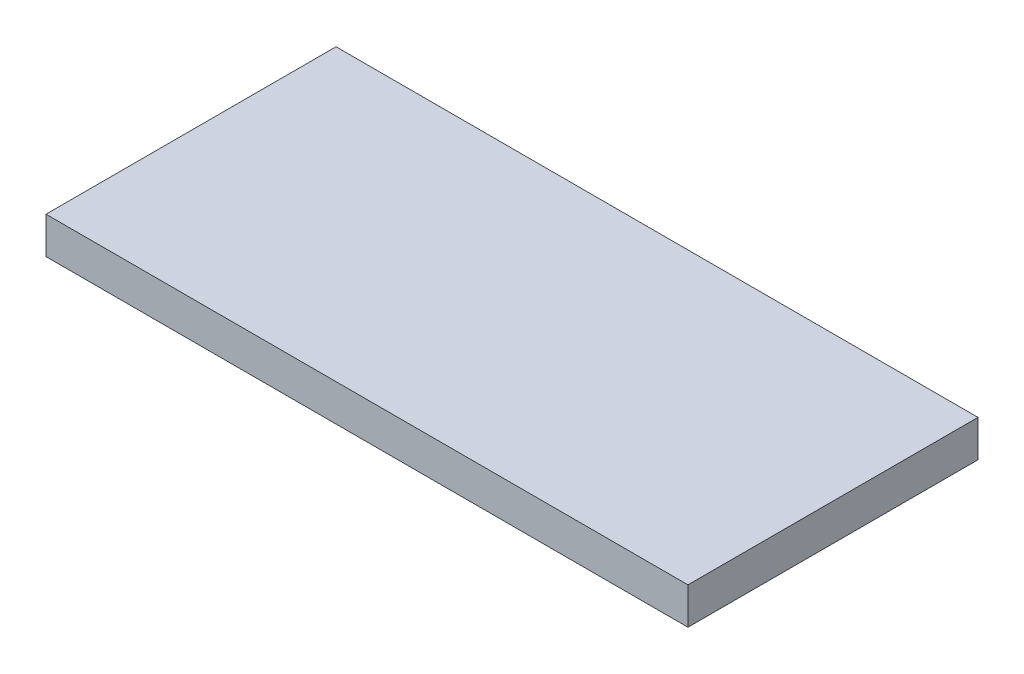
ISO-10303-21;
HEADER;
FILE_DESCRIPTION(('STEP AP214'),'2;1');
FILE_NAME('part.step','',(''),(''),'','','');
FILE_SCHEMA(('AUTOMOTIVE_DESIGN { 1 0 10303 214 1 1 1 1 }'));
ENDSEC;
DATA;
#1=APPLICATION_CONTEXT('core data for automotive mechanical design processes');
#2=APPLICATION_PROTOCOL_DEFINITION('international standard','automotive_design',2000,#1);
#3=PRODUCT_CONTEXT('',#1,'mechanical');
#4=PRODUCT('Part','Part','',(#3));
#5=PRODUCT_RELATED_PRODUCT_CATEGORY('part','',(#4));
#6=PRODUCT_DEFINITION_FORMATION('','',#4);
#7=PRODUCT_DEFINITION_CONTEXT('part definition',#1,'design');
#8=PRODUCT_DEFINITION('design','',#6,#7);
#9=PRODUCT_DEFINITION_SHAPE('','',#8);
#10=(LENGTH_UNIT() NAMED_UNIT(*) SI_UNIT(.MILLI.,.METRE.));
#11=(NAMED_UNIT(*) PLANE_ANGLE_UNIT() SI_UNIT($,.RADIAN.));
#12=(NAMED_UNIT(*) SI_UNIT($,.STERADIAN.) SOLID_ANGLE_UNIT());
#13=UNCERTAINTY_MEASURE_WITH_UNIT(LENGTH_MEASURE(1.E-05),#10,'distance_accuracy_value','');
#14=(GEOMETRIC_REPRESENTATION_CONTEXT(3) GLOBAL_UNCERTAINTY_ASSIGNED_CONTEXT((#13)) GLOBAL_UNIT_ASSIGNED_CONTEXT((#10,
#11,#12)) REPRESENTATION_CONTEXT('',''));
#15=CARTESIAN_POINT('',(0.,0.,0.));
#16=DIRECTION('',(0.,0.,1.));
#17=DIRECTION('',(1.,0.,0.));
#18=AXIS2_PLACEMENT_3D('',#15,#16,#17);
#19=CARTESIAN_POINT('',(-138.528545061435,19.,-77.0714285714286));
#20=DIRECTION('',(1.,0.,0.));
#21=DIRECTION('',(0.,0.,-1.));
#22=AXIS2_PLACEMENT_3D('',#19,#20,#21);
#23=PLANE('',#22);
#24=DIRECTION('',(0.,0.,1.));
#25=VECTOR('',#24,1.);
#26=CARTESIAN_POINT('',(-138.528545061435,0.,-77.0714285714286));
#27=LINE('',#26,#25);
#28=CARTESIAN_POINT('',(-138.528545061435,0.,-77.0714285714286));
#29=VERTEX_POINT('',#28);
#30=CARTESIAN_POINT('',(-138.528545061435,0.,72.9285714285714));
#31=VERTEX_POINT('',#30);
#32=EDGE_CURVE('E96',#29,#31,#27,.T.);
#33=ORIENTED_EDGE('',*,*,#32,.T.);
#34=DIRECTION('',(0.,-1.,0.));
#35=VECTOR('',#34,1.);
#36=CARTESIAN_POINT('',(-138.528545061435,19.,72.9285714285714));
#37=LINE('',#36,#35);
#38=CARTESIAN_POINT('',(-138.528545061435,19.,72.9285714285714));
#39=VERTEX_POINT('',#38);
#40=EDGE_CURVE('E11',#39,#31,#37,.T.);
#41=ORIENTED_EDGE('',*,*,#40,.F.);
#42=DIRECTION('',(0.,0.,1.));
#43=VECTOR('',#42,1.);
#44=CARTESIAN_POINT('',(-138.528545061435,19.,-77.0714285714286));
#45=LINE('',#44,#43);
#46=CARTESIAN_POINT('',(-138.528545061435,19.,-77.0714285714286));
#47=VERTEX_POINT('',#46);
#48=EDGE_CURVE('E84',#47,#39,#45,.T.);
#49=ORIENTED_EDGE('',*,*,#48,.F.);
#50=DIRECTION('',(0.,-1.,0.));
#51=VECTOR('',#50,1.);
#52=CARTESIAN_POINT('',(-138.528545061435,19.,-77.0714285714286));
#53=LINE('',#52,#51);
#54=EDGE_CURVE('E92',#47,#29,#53,.T.);
#55=ORIENTED_EDGE('',*,*,#54,.T.);
#56=EDGE_LOOP('',(#33,#41,#49,#55));
#57=FACE_BOUND('',#56,.T.);
#58=ADVANCED_FACE('F33',(#57),#23,.F.);
#59=CARTESIAN_POINT('',(-138.528545061435,19.,72.9285714285714));
#60=DIRECTION('',(0.,0.,-1.));
#61=DIRECTION('',(-1.,0.,0.));
#62=AXIS2_PLACEMENT_3D('',#59,#60,#61);
#63=PLANE('',#62);
#64=DIRECTION('',(1.,0.,0.));
#65=VECTOR('',#64,1.);
#66=CARTESIAN_POINT('',(-138.528545061435,0.,72.9285714285714));
#67=LINE('',#66,#65);
#68=CARTESIAN_POINT('',(193.471454938565,0.,72.9285714285714));
#69=VERTEX_POINT('',#68);
#70=EDGE_CURVE('E88',#31,#69,#67,.T.);
#71=ORIENTED_EDGE('',*,*,#70,.T.);
#72=DIRECTION('',(0.,-1.,0.));
#73=VECTOR('',#72,1.);
#74=CARTESIAN_POINT('',(193.471454938565,19.,72.9285714285714));
#75=LINE('',#74,#73);
#76=CARTESIAN_POINT('',(193.471454938565,19.,72.9285714285714));
#77=VERTEX_POINT('',#76);
#78=EDGE_CURVE('E41',#77,#69,#75,.T.);
#79=ORIENTED_EDGE('',*,*,#78,.F.);
#80=DIRECTION('',(1.,0.,0.));
#81=VECTOR('',#80,1.);
#82=CARTESIAN_POINT('',(-138.528545061435,19.,72.9285714285714));
#83=LINE('',#82,#81);
#84=EDGE_CURVE('E79',#39,#77,#83,.T.);
#85=ORIENTED_EDGE('',*,*,#84,.F.);
#86=ORIENTED_EDGE('',*,*,#40,.T.);
#87=EDGE_LOOP('',(#71,#79,#85,#86));
#88=FACE_BOUND('',#87,.T.);
#89=ADVANCED_FACE('F87',(#88),#63,.F.);
#90=CARTESIAN_POINT('',(193.471454938565,19.,-77.0714285714286));
#91=DIRECTION('',(-1.,0.,0.));
#92=DIRECTION('',(0.,0.,1.));
#93=AXIS2_PLACEMENT_3D('',#90,#91,#92);
#94=PLANE('',#93);
#95=DIRECTION('',(0.,0.,-1.));
#96=VECTOR('',#95,1.);
#97=CARTESIAN_POINT('',(193.471454938565,0.,-77.0714285714286));
#98=LINE('',#97,#96);
#99=CARTESIAN_POINT('',(193.471454938565,0.,-77.0714285714286));
#100=VERTEX_POINT('',#99);
#101=EDGE_CURVE('E66',#69,#100,#98,.T.);
#102=ORIENTED_EDGE('',*,*,#101,.T.);
#103=DIRECTION('',(0.,-1.,0.));
#104=VECTOR('',#103,1.);
#105=CARTESIAN_POINT('',(193.471454938565,19.,-77.0714285714286));
#106=LINE('',#105,#104);
#107=CARTESIAN_POINT('',(193.471454938565,19.,-77.0714285714286));
#108=VERTEX_POINT('',#107);
#109=EDGE_CURVE('E89',#108,#100,#106,.T.);
#110=ORIENTED_EDGE('',*,*,#109,.F.);
#111=DIRECTION('',(0.,0.,-1.));
#112=VECTOR('',#111,1.);
#113=CARTESIAN_POINT('',(193.471454938565,19.,-77.0714285714286));
#114=LINE('',#113,#112);
#115=EDGE_CURVE('E82',#77,#108,#114,.T.);
#116=ORIENTED_EDGE('',*,*,#115,.F.);
#117=ORIENTED_EDGE('',*,*,#78,.T.);
#118=EDGE_LOOP('',(#102,#110,#116,#117));
#119=FACE_BOUND('',#118,.T.);
#120=ADVANCED_FACE('F90',(#119),#94,.F.);
#121=CARTESIAN_POINT('',(-138.528545061435,19.,-77.0714285714286));
#122=DIRECTION('',(0.,0.,1.));
#123=DIRECTION('',(1.,0.,0.));
#124=AXIS2_PLACEMENT_3D('',#121,#122,#123);
#125=PLANE('',#124);
#126=DIRECTION('',(-1.,0.,0.));
#127=VECTOR('',#126,1.);
#128=CARTESIAN_POINT('',(-138.528545061435,0.,-77.0714285714286));
#129=LINE('',#128,#127);
#130=EDGE_CURVE('E72',#100,#29,#129,.T.);
#131=ORIENTED_EDGE('',*,*,#130,.T.);
#132=ORIENTED_EDGE('',*,*,#54,.F.);
#133=DIRECTION('',(-1.,0.,0.));
#134=VECTOR('',#133,1.);
#135=CARTESIAN_POINT('',(-138.528545061435,19.,-77.0714285714286));
#136=LINE('',#135,#134);
#137=EDGE_CURVE('E49',#108,#47,#136,.T.);
#138=ORIENTED_EDGE('',*,*,#137,.F.);
#139=ORIENTED_EDGE('',*,*,#109,.T.);
#140=EDGE_LOOP('',(#131,#132,#138,#139));
#141=FACE_BOUND('',#140,.T.);
#142=ADVANCED_FACE('F103',(#141),#125,.F.);
#143=CARTESIAN_POINT('',(0.,19.,0.));
#144=DIRECTION('',(0.,1.,0.));
#145=DIRECTION('',(0.,0.,1.));
#146=AXIS2_PLACEMENT_3D('',#143,#144,#145);
#147=PLANE('',#146);
#148=ORIENTED_EDGE('',*,*,#48,.T.);
#149=ORIENTED_EDGE('',*,*,#84,.T.);
#150=ORIENTED_EDGE('',*,*,#115,.T.);
#151=ORIENTED_EDGE('',*,*,#137,.T.);
#152=EDGE_LOOP('',(#148,#149,#150,#151));
#153=FACE_BOUND('',#152,.T.);
#154=ADVANCED_FACE('F80',(#153),#147,.T.);
#155=CARTESIAN_POINT('',(0.,0.,0.));
#156=DIRECTION('',(0.,1.,0.));
#157=DIRECTION('',(0.,0.,1.));
#158=AXIS2_PLACEMENT_3D('',#155,#156,#157);
#159=PLANE('',#158);
#160=ORIENTED_EDGE('',*,*,#32,.F.);
#161=ORIENTED_EDGE('',*,*,#130,.F.);
#162=ORIENTED_EDGE('',*,*,#101,.F.);
#163=ORIENTED_EDGE('',*,*,#70,.F.);
#164=EDGE_LOOP('',(#160,#161,#162,#163));
#165=FACE_BOUND('',#164,.T.);
#166=ADVANCED_FACE('F106',(#165),#159,.F.);
#167=CLOSED_SHELL('',(#58,#89,#120,#142,#154,#166));
#168=MANIFOLD_SOLID_BREP('B2',#167);
#169=ADVANCED_BREP_SHAPE_REPRESENTATION('',(#18,#168),#14);
#170=SHAPE_DEFINITION_REPRESENTATION(#9,#169);
ENDSEC;
END-ISO-10303-21;
